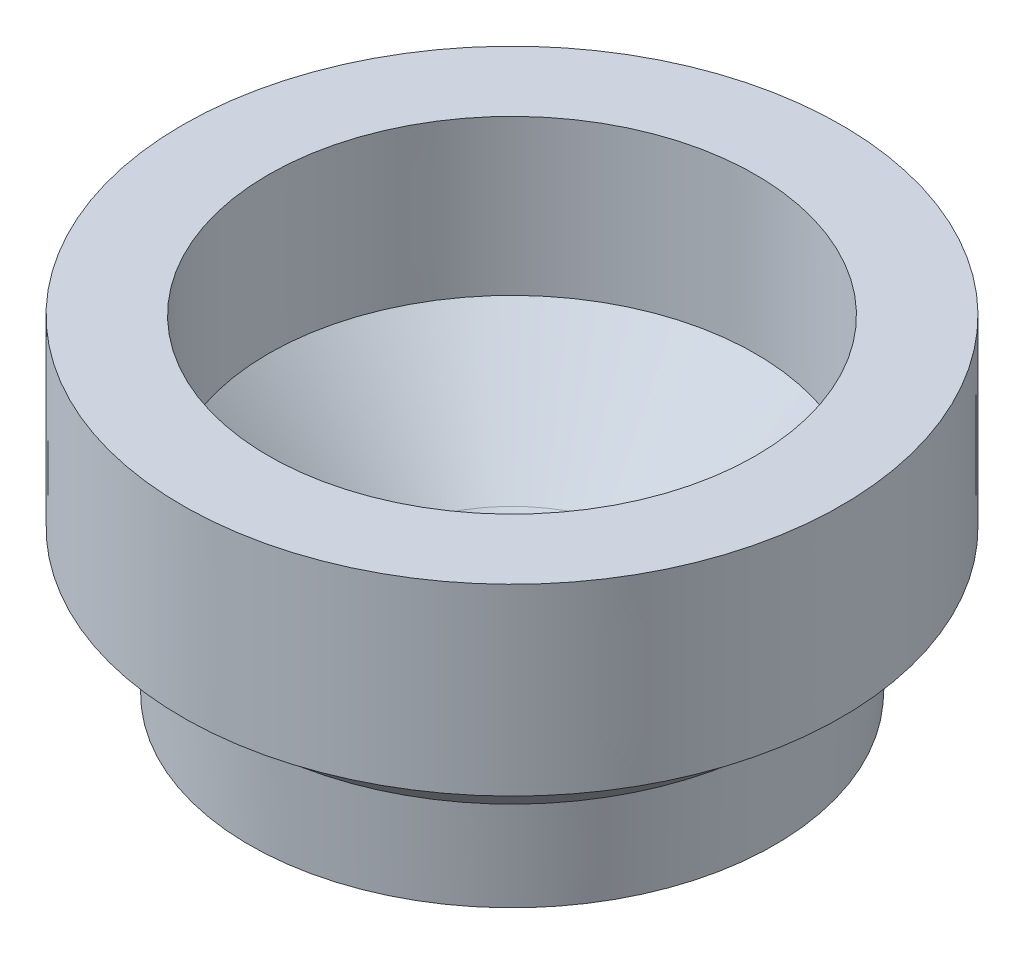
ISO-10303-21;
HEADER;
FILE_DESCRIPTION(('STEP AP214'),'2;1');
FILE_NAME('part.step','',(''),(''),'','','');
FILE_SCHEMA(('AUTOMOTIVE_DESIGN { 1 0 10303 214 1 1 1 1 }'));
ENDSEC;
DATA;
#1=APPLICATION_CONTEXT('core data for automotive mechanical design processes');
#2=APPLICATION_PROTOCOL_DEFINITION('international standard','automotive_design',2000,#1);
#3=PRODUCT_CONTEXT('',#1,'mechanical');
#4=PRODUCT('Part','Part','',(#3));
#5=PRODUCT_RELATED_PRODUCT_CATEGORY('part','',(#4));
#6=PRODUCT_DEFINITION_FORMATION('','',#4);
#7=PRODUCT_DEFINITION_CONTEXT('part definition',#1,'design');
#8=PRODUCT_DEFINITION('design','',#6,#7);
#9=PRODUCT_DEFINITION_SHAPE('','',#8);
#10=(LENGTH_UNIT() NAMED_UNIT(*) SI_UNIT(.MILLI.,.METRE.));
#11=(NAMED_UNIT(*) PLANE_ANGLE_UNIT() SI_UNIT($,.RADIAN.));
#12=(NAMED_UNIT(*) SI_UNIT($,.STERADIAN.) SOLID_ANGLE_UNIT());
#13=UNCERTAINTY_MEASURE_WITH_UNIT(LENGTH_MEASURE(1.E-05),#10,'distance_accuracy_value','');
#14=(GEOMETRIC_REPRESENTATION_CONTEXT(3) GLOBAL_UNCERTAINTY_ASSIGNED_CONTEXT((#13)) GLOBAL_UNIT_ASSIGNED_CONTEXT((#10,
#11,#12)) REPRESENTATION_CONTEXT('',''));
#15=CARTESIAN_POINT('',(0.,0.,0.));
#16=DIRECTION('',(0.,0.,1.));
#17=DIRECTION('',(1.,0.,0.));
#18=AXIS2_PLACEMENT_3D('',#15,#16,#17);
#19=CARTESIAN_POINT('',(0.,0.,0.));
#20=DIRECTION('',(4.88883233479214E-05,0.999999998804966,0.));
#21=DIRECTION('',(-0.999999998804966,4.88883233479214E-05,0.));
#22=AXIS2_PLACEMENT_3D('',#19,#20,#21);
#23=CONICAL_SURFACE('',#22,0.,1.57074743847153);
#24=CARTESIAN_POINT('',(2.44226776430036E-08,0.000499560548234725,0.));
#25=DIRECTION('',(4.88883233479214E-05,0.999999998804966,0.));
#26=DIRECTION('',(-0.999999998804966,4.88883233479214E-05,0.));
#27=AXIS2_PLACEMENT_3D('',#24,#25,#26);
#28=CIRCLE('',#27,10.2184021461929);
#29=CARTESIAN_POINT('',(-10.2184021095589,0.000999121096456896,0.));
#30=VERTEX_POINT('',#29);
#31=EDGE_CURVE('E11',#30,#30,#28,.T.);
#32=ORIENTED_EDGE('',*,*,#31,.F.);
#33=EDGE_LOOP('',(#32));
#34=FACE_BOUND('',#33,.T.);
#35=CARTESIAN_POINT('',(0.,0.,0.));
#36=VERTEX_POINT('',#35);
#37=VERTEX_LOOP('',#36);
#38=FACE_BOUND('',#37,.T.);
#39=ADVANCED_FACE('F36',(#34,#38),#23,.T.);
#40=CARTESIAN_POINT('',(2.44226776430036E-08,0.000499560548234725,0.));
#41=DIRECTION('',(4.88883233479214E-05,0.999999998804966,0.));
#42=DIRECTION('',(-0.999999998804966,4.88883233479214E-05,0.));
#43=AXIS2_PLACEMENT_3D('',#40,#41,#42);
#44=CONICAL_SURFACE('',#43,10.2184021461929,0.956579471278437);
#45=CARTESIAN_POINT('',(6.80057293243313E-05,1.39104237138772,0.));
#46=DIRECTION('',(4.88883233479214E-05,0.999999998804966,0.));
#47=DIRECTION('',(-0.999999998804966,4.88883233479214E-05,0.));
#48=AXIS2_PLACEMENT_3D('',#45,#46,#47);
#49=CIRCLE('',#48,12.1902042330944);
#50=CARTESIAN_POINT('',(-12.1901362127973,1.39163833003395,0.));
#51=VERTEX_POINT('',#50);
#52=EDGE_CURVE('E43',#51,#51,#49,.T.);
#53=ORIENTED_EDGE('',*,*,#52,.F.);
#54=EDGE_LOOP('',(#53));
#55=FACE_BOUND('',#54,.T.);
#56=ORIENTED_EDGE('',*,*,#31,.T.);
#57=EDGE_LOOP('',(#56));
#58=FACE_BOUND('',#57,.T.);
#59=ADVANCED_FACE('F85',(#55,#58),#44,.T.);
#60=CARTESIAN_POINT('',(6.80057293243313E-05,1.39104237138772,0.));
#61=DIRECTION('',(4.88883233479214E-05,0.999999998804966,0.));
#62=DIRECTION('',(-0.999999998804966,4.88883233479214E-05,0.));
#63=AXIS2_PLACEMENT_3D('',#60,#61,#62);
#64=CONICAL_SURFACE('',#63,12.1902042330944,0.046428817548589);
#65=CARTESIAN_POINT('',(0.000278566124509343,5.69800936297177,0.));
#66=DIRECTION('',(4.88883233479214E-05,0.999999998804966,0.));
#67=DIRECTION('',(-0.999999998804966,4.88883233479214E-05,0.));
#68=AXIS2_PLACEMENT_3D('',#65,#66,#67);
#69=CIRCLE('',#68,12.3903154275462);
#70=CARTESIAN_POINT('',(-12.3900368466148,5.69861510471878,0.));
#71=VERTEX_POINT('',#70);
#72=EDGE_CURVE('E78',#71,#71,#69,.T.);
#73=ORIENTED_EDGE('',*,*,#72,.F.);
#74=EDGE_LOOP('',(#73));
#75=FACE_BOUND('',#74,.T.);
#76=ORIENTED_EDGE('',*,*,#52,.T.);
#77=EDGE_LOOP('',(#76));
#78=FACE_BOUND('',#77,.T.);
#79=ADVANCED_FACE('F83',(#75,#78),#64,.T.);
#80=CARTESIAN_POINT('',(0.000278566124509343,5.69800936297177,0.));
#81=DIRECTION('',(4.88883233479214E-05,0.999999998804966,0.));
#82=DIRECTION('',(-0.999999998804966,4.88883233479214E-05,0.));
#83=AXIS2_PLACEMENT_3D('',#80,#81,#82);
#84=CONICAL_SURFACE('',#83,12.3903154275462,0.836970734870803);
#85=CARTESIAN_POINT('',(0.000394736180475153,8.07424253833023,0.));
#86=DIRECTION('',(4.88883233479214E-05,0.999999998804966,0.));
#87=DIRECTION('',(-0.999999998804966,4.88883233479214E-05,0.));
#88=AXIS2_PLACEMENT_3D('',#85,#86,#87);
#89=CIRCLE('',#88,15.0252149746334);
#90=CARTESIAN_POINT('',(-15.0248202204972,8.07497709589828,0.));
#91=VERTEX_POINT('',#90);
#92=EDGE_CURVE('E75',#91,#91,#89,.T.);
#93=ORIENTED_EDGE('',*,*,#92,.F.);
#94=EDGE_LOOP('',(#93));
#95=FACE_BOUND('',#94,.T.);
#96=ORIENTED_EDGE('',*,*,#72,.T.);
#97=EDGE_LOOP('',(#96));
#98=FACE_BOUND('',#97,.T.);
#99=ADVANCED_FACE('F103',(#95,#98),#84,.T.);
#100=CARTESIAN_POINT('',(0.000394736180475153,8.07424253833023,0.));
#101=DIRECTION('',(4.88883233479214E-05,0.999999998804966,0.));
#102=DIRECTION('',(-0.999999998804966,4.88883233479214E-05,0.));
#103=AXIS2_PLACEMENT_3D('',#100,#101,#102);
#104=CONICAL_SURFACE('',#103,15.0252149746334,1.57029737227398);
#105=CARTESIAN_POINT('',(0.000394742730332811,8.07437651424109,0.));
#106=DIRECTION('',(4.88883233479214E-05,0.999999998804966,0.));
#107=DIRECTION('',(-0.999999998804966,4.88883233479214E-05,0.));
#108=AXIS2_PLACEMENT_3D('',#105,#106,#107);
#109=CIRCLE('',#108,15.2937282244203);
#110=CARTESIAN_POINT('',(-15.2933334634134,8.07512419897172,0.));
#111=VERTEX_POINT('',#110);
#112=EDGE_CURVE('E72',#111,#111,#109,.T.);
#113=ORIENTED_EDGE('',*,*,#112,.F.);
#114=EDGE_LOOP('',(#113));
#115=FACE_BOUND('',#114,.T.);
#116=ORIENTED_EDGE('',*,*,#92,.T.);
#117=EDGE_LOOP('',(#116));
#118=FACE_BOUND('',#117,.T.);
#119=ADVANCED_FACE('F111',(#115,#118),#104,.T.);
#120=CARTESIAN_POINT('',(0.000394742730332811,8.07437651424109,0.));
#121=DIRECTION('',(-4.88883233479214E-05,-0.999999998804966,0.));
#122=DIRECTION('',(0.999999998804966,-4.88883233479214E-05,0.));
#123=AXIS2_PLACEMENT_3D('',#120,#121,#122);
#124=CONICAL_SURFACE('',#123,15.2937282244203,4.88883233673014E-05);
#125=CARTESIAN_POINT('',(0.000811020988057779,16.5892575475912,0.));
#126=DIRECTION('',(4.88883233479214E-05,0.999999998804966,0.));
#127=DIRECTION('',(-0.999999998804966,4.88883233479214E-05,0.));
#128=AXIS2_PLACEMENT_3D('',#125,#126,#127);
#129=CIRCLE('',#128,15.293311946162);
#130=CARTESIAN_POINT('',(-15.2925009068979,16.5900052119706,0.));
#131=VERTEX_POINT('',#130);
#132=EDGE_CURVE('E69',#131,#131,#129,.T.);
#133=ORIENTED_EDGE('',*,*,#132,.F.);
#134=EDGE_LOOP('',(#133));
#135=FACE_BOUND('',#134,.T.);
#136=ORIENTED_EDGE('',*,*,#112,.T.);
#137=EDGE_LOOP('',(#136));
#138=FACE_BOUND('',#137,.T.);
#139=ADVANCED_FACE('F119',(#135,#138),#124,.T.);
#140=CARTESIAN_POINT('',(0.000811020988057779,16.5892575475912,0.));
#141=DIRECTION('',(4.88883233479214E-05,0.999999998804966,0.));
#142=DIRECTION('',(-0.999999998804966,4.88883233479214E-05,0.));
#143=AXIS2_PLACEMENT_3D('',#140,#141,#142);
#144=CONICAL_SURFACE('',#143,15.293311946162,1.57074743847153);
#145=CARTESIAN_POINT('',(0.000811011457384571,16.5890625997479,0.));
#146=DIRECTION('',(4.88883233479214E-05,0.999999998804966,0.));
#147=DIRECTION('',(-0.999999998804966,4.88883233479214E-05,0.));
#148=AXIS2_PLACEMENT_3D('',#145,#146,#147);
#149=CIRCLE('',#148,11.305696297019);
#150=CARTESIAN_POINT('',(-11.3048852720509,16.5896153162842,0.));
#151=VERTEX_POINT('',#150);
#152=EDGE_CURVE('E66',#151,#151,#149,.T.);
#153=ORIENTED_EDGE('',*,*,#152,.F.);
#154=EDGE_LOOP('',(#153));
#155=FACE_BOUND('',#154,.T.);
#156=ORIENTED_EDGE('',*,*,#132,.T.);
#157=EDGE_LOOP('',(#156));
#158=FACE_BOUND('',#157,.T.);
#159=ADVANCED_FACE('F127',(#155,#158),#144,.F.);
#160=CARTESIAN_POINT('',(0.000811011457384571,16.5890625997479,0.));
#161=DIRECTION('',(-4.88883233479214E-05,-0.999999998804966,0.));
#162=DIRECTION('',(0.999999998804966,-4.88883233479214E-05,0.));
#163=AXIS2_PLACEMENT_3D('',#160,#161,#162);
#164=CONICAL_SURFACE('',#163,11.305696297019,4.88883233616478E-05);
#165=CARTESIAN_POINT('',(0.000459200604522315,9.39284828210577,0.));
#166=DIRECTION('',(4.88883233479214E-05,0.999999998804966,0.));
#167=DIRECTION('',(-0.999999998804966,4.88883233479214E-05,0.));
#168=AXIS2_PLACEMENT_3D('',#165,#166,#167);
#169=CIRCLE('',#168,11.3060481078722);
#170=CARTESIAN_POINT('',(-11.3055888937566,9.39340101584145,0.));
#171=VERTEX_POINT('',#170);
#172=EDGE_CURVE('E61',#171,#171,#169,.T.);
#173=ORIENTED_EDGE('',*,*,#172,.F.);
#174=EDGE_LOOP('',(#173));
#175=FACE_BOUND('',#174,.T.);
#176=ORIENTED_EDGE('',*,*,#152,.T.);
#177=EDGE_LOOP('',(#176));
#178=FACE_BOUND('',#177,.T.);
#179=ADVANCED_FACE('F135',(#175,#178),#164,.F.);
#180=CARTESIAN_POINT('',(0.000459200604522315,9.39284828210577,0.));
#181=DIRECTION('',(4.88883233479214E-05,0.999999998804966,0.));
#182=DIRECTION('',(-0.999999998804966,4.88883233479214E-05,0.));
#183=AXIS2_PLACEMENT_3D('',#180,#181,#182);
#184=CONICAL_SURFACE('',#183,11.3060481078722,0.763557234012171);
#185=CARTESIAN_POINT('',(0.000212010529217377,4.33662916715738,0.));
#186=DIRECTION('',(4.88883233479214E-05,0.999999998804966,0.));
#187=DIRECTION('',(-0.999999998804966,4.88883233479214E-05,0.));
#188=AXIS2_PLACEMENT_3D('',#185,#186,#187);
#189=CIRCLE('',#188,6.46600688548627);
#190=CARTESIAN_POINT('',(-6.46579486722996,4.33694527939277,0.));
#191=VERTEX_POINT('',#190);
#192=EDGE_CURVE('E58',#191,#191,#189,.T.);
#193=ORIENTED_EDGE('',*,*,#192,.F.);
#194=EDGE_LOOP('',(#193));
#195=FACE_BOUND('',#194,.T.);
#196=ORIENTED_EDGE('',*,*,#172,.T.);
#197=EDGE_LOOP('',(#196));
#198=FACE_BOUND('',#197,.T.);
#199=ADVANCED_FACE('F143',(#195,#198),#184,.F.);
#200=CARTESIAN_POINT('',(0.000295161536657297,6.03746490146864,0.));
#201=DIRECTION('',(4.88883233479214E-05,0.999999998804966,0.));
#202=DIRECTION('',(-0.999999998804966,4.88883233479214E-05,0.));
#203=AXIS2_PLACEMENT_3D('',#200,#201,#202);
#204=TOROIDAL_SURFACE('',#203,4.53118385269636,2.57611769339808);
#205=CARTESIAN_POINT('',(0.000169219580838062,3.46134964440407,0.));
#206=DIRECTION('',(4.88883233479214E-05,0.999999998804966,0.));
#207=DIRECTION('',(-0.999999998804966,4.88883233479214E-05,0.));
#208=AXIS2_PLACEMENT_3D('',#205,#206,#207);
#209=CIRCLE('',#208,4.52764313293869);
#210=CARTESIAN_POINT('',(-4.52747390794716,3.46157099328556,0.));
#211=VERTEX_POINT('',#210);
#212=EDGE_CURVE('E56',#211,#211,#209,.T.);
#213=ORIENTED_EDGE('',*,*,#212,.F.);
#214=EDGE_LOOP('',(#213));
#215=FACE_BOUND('',#214,.T.);
#216=ORIENTED_EDGE('',*,*,#192,.T.);
#217=EDGE_LOOP('',(#216));
#218=FACE_BOUND('',#217,.T.);
#219=ADVANCED_FACE('F52',(#215,#218),#204,.F.);
#220=CARTESIAN_POINT('',(0.000169219580838062,3.46134964440407,0.));
#221=DIRECTION('',(4.88883233479214E-05,0.999999998804966,0.));
#222=DIRECTION('',(-0.999999998804966,4.88883233479214E-05,0.));
#223=AXIS2_PLACEMENT_3D('',#220,#221,#222);
#224=CONICAL_SURFACE('',#223,4.52764313293869,1.57074743847153);
#225=CARTESIAN_POINT('',(0.000169208759462358,3.46112829552259,0.));
#226=VERTEX_POINT('',#225);
#227=VERTEX_LOOP('',#226);
#228=FACE_BOUND('',#227,.T.);
#229=ORIENTED_EDGE('',*,*,#212,.T.);
#230=EDGE_LOOP('',(#229));
#231=FACE_BOUND('',#230,.T.);
#232=ADVANCED_FACE('F49',(#228,#231),#224,.F.);
#233=CLOSED_SHELL('',(#39,#59,#79,#99,#119,#139,#159,#179,#199,#219,#232));
#234=MANIFOLD_SOLID_BREP('B2',#233);
#235=ADVANCED_BREP_SHAPE_REPRESENTATION('',(#18,#234),#14);
#236=SHAPE_DEFINITION_REPRESENTATION(#9,#235);
ENDSEC;
END-ISO-10303-21;
